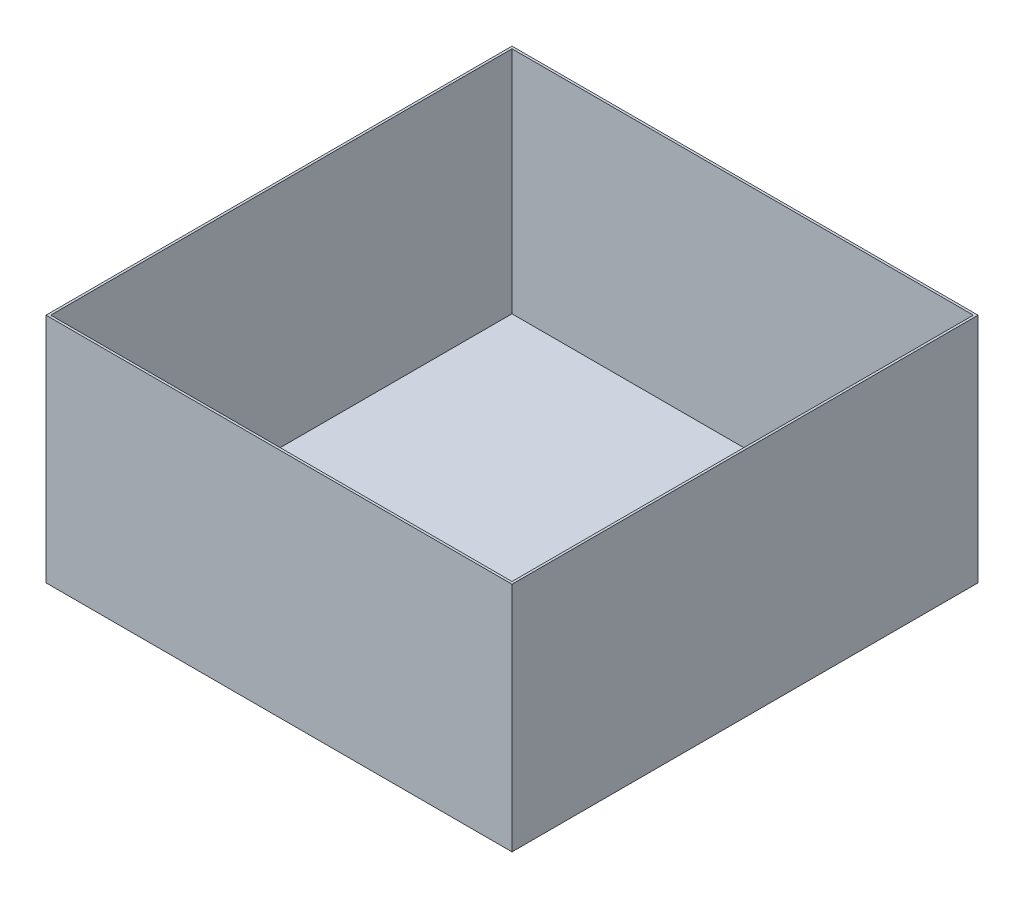
ISO-10303-21;
HEADER;
FILE_DESCRIPTION(('STEP AP214'),'2;1');
FILE_NAME('part.step','',(''),(''),'','','');
FILE_SCHEMA(('AUTOMOTIVE_DESIGN { 1 0 10303 214 1 1 1 1 }'));
ENDSEC;
DATA;
#1=APPLICATION_CONTEXT('core data for automotive mechanical design processes');
#2=APPLICATION_PROTOCOL_DEFINITION('international standard','automotive_design',2000,#1);
#3=PRODUCT_CONTEXT('',#1,'mechanical');
#4=PRODUCT('Part','Part','',(#3));
#5=PRODUCT_RELATED_PRODUCT_CATEGORY('part','',(#4));
#6=PRODUCT_DEFINITION_FORMATION('','',#4);
#7=PRODUCT_DEFINITION_CONTEXT('part definition',#1,'design');
#8=PRODUCT_DEFINITION('design','',#6,#7);
#9=PRODUCT_DEFINITION_SHAPE('','',#8);
#10=(LENGTH_UNIT() NAMED_UNIT(*) SI_UNIT(.MILLI.,.METRE.));
#11=(NAMED_UNIT(*) PLANE_ANGLE_UNIT() SI_UNIT($,.RADIAN.));
#12=(NAMED_UNIT(*) SI_UNIT($,.STERADIAN.) SOLID_ANGLE_UNIT());
#13=UNCERTAINTY_MEASURE_WITH_UNIT(LENGTH_MEASURE(1.E-05),#10,'distance_accuracy_value','');
#14=(GEOMETRIC_REPRESENTATION_CONTEXT(3) GLOBAL_UNCERTAINTY_ASSIGNED_CONTEXT((#13)) GLOBAL_UNIT_ASSIGNED_CONTEXT((#10,
#11,#12)) REPRESENTATION_CONTEXT('',''));
#15=CARTESIAN_POINT('',(0.,0.,0.));
#16=DIRECTION('',(0.,0.,1.));
#17=DIRECTION('',(1.,0.,0.));
#18=AXIS2_PLACEMENT_3D('',#15,#16,#17);
#19=CARTESIAN_POINT('',(-41.3831091569143,100.,-24.1132844986964));
#20=DIRECTION('',(1.,0.,0.));
#21=DIRECTION('',(0.,0.,-1.));
#22=AXIS2_PLACEMENT_3D('',#19,#20,#21);
#23=PLANE('',#22);
#24=DIRECTION('',(0.,0.,1.));
#25=VECTOR('',#24,1.);
#26=CARTESIAN_POINT('',(-41.3831091569143,0.,-24.1132844986964));
#27=LINE('',#26,#25);
#28=CARTESIAN_POINT('',(-41.3831091569143,0.,-24.1132844986964));
#29=VERTEX_POINT('',#28);
#30=CARTESIAN_POINT('',(-41.3831091569143,0.,176.886715501304));
#31=VERTEX_POINT('',#30);
#32=EDGE_CURVE('E147',#29,#31,#27,.T.);
#33=ORIENTED_EDGE('',*,*,#32,.T.);
#34=DIRECTION('',(0.,-1.,0.));
#35=VECTOR('',#34,1.);
#36=CARTESIAN_POINT('',(-41.3831091569143,100.,176.886715501304));
#37=LINE('',#36,#35);
#38=CARTESIAN_POINT('',(-41.3831091569143,100.,176.886715501304));
#39=VERTEX_POINT('',#38);
#40=EDGE_CURVE('E11',#39,#31,#37,.T.);
#41=ORIENTED_EDGE('',*,*,#40,.F.);
#42=DIRECTION('',(0.,0.,1.));
#43=VECTOR('',#42,1.);
#44=CARTESIAN_POINT('',(-41.3831091569143,100.,-24.1132844986964));
#45=LINE('',#44,#43);
#46=CARTESIAN_POINT('',(-41.3831091569143,100.,-24.1132844986964));
#47=VERTEX_POINT('',#46);
#48=EDGE_CURVE('E140',#47,#39,#45,.T.);
#49=ORIENTED_EDGE('',*,*,#48,.F.);
#50=DIRECTION('',(0.,-1.,0.));
#51=VECTOR('',#50,1.);
#52=CARTESIAN_POINT('',(-41.3831091569143,100.,-24.1132844986964));
#53=LINE('',#52,#51);
#54=EDGE_CURVE('E146',#47,#29,#53,.T.);
#55=ORIENTED_EDGE('',*,*,#54,.T.);
#56=EDGE_LOOP('',(#33,#41,#49,#55));
#57=FACE_BOUND('',#56,.T.);
#58=ADVANCED_FACE('F33',(#57),#23,.F.);
#59=CARTESIAN_POINT('',(-41.3831091569143,100.,176.886715501304));
#60=DIRECTION('',(0.,0.,-1.));
#61=DIRECTION('',(-1.,0.,0.));
#62=AXIS2_PLACEMENT_3D('',#59,#60,#61);
#63=PLANE('',#62);
#64=DIRECTION('',(1.,0.,0.));
#65=VECTOR('',#64,1.);
#66=CARTESIAN_POINT('',(-41.3831091569143,0.,176.886715501304));
#67=LINE('',#66,#65);
#68=CARTESIAN_POINT('',(159.616890843086,0.,176.886715501304));
#69=VERTEX_POINT('',#68);
#70=EDGE_CURVE('E150',#31,#69,#67,.T.);
#71=ORIENTED_EDGE('',*,*,#70,.T.);
#72=DIRECTION('',(0.,-1.,0.));
#73=VECTOR('',#72,1.);
#74=CARTESIAN_POINT('',(159.616890843086,100.,176.886715501304));
#75=LINE('',#74,#73);
#76=CARTESIAN_POINT('',(159.616890843086,100.,176.886715501304));
#77=VERTEX_POINT('',#76);
#78=EDGE_CURVE('E40',#77,#69,#75,.T.);
#79=ORIENTED_EDGE('',*,*,#78,.F.);
#80=DIRECTION('',(1.,0.,0.));
#81=VECTOR('',#80,1.);
#82=CARTESIAN_POINT('',(-41.3831091569143,100.,176.886715501304));
#83=LINE('',#82,#81);
#84=EDGE_CURVE('E84',#39,#77,#83,.T.);
#85=ORIENTED_EDGE('',*,*,#84,.F.);
#86=ORIENTED_EDGE('',*,*,#40,.T.);
#87=EDGE_LOOP('',(#71,#79,#85,#86));
#88=FACE_BOUND('',#87,.T.);
#89=ADVANCED_FACE('F179',(#88),#63,.F.);
#90=CARTESIAN_POINT('',(159.616890843086,100.,-24.1132844986964));
#91=DIRECTION('',(-1.,0.,0.));
#92=DIRECTION('',(0.,0.,1.));
#93=AXIS2_PLACEMENT_3D('',#90,#91,#92);
#94=PLANE('',#93);
#95=DIRECTION('',(0.,0.,-1.));
#96=VECTOR('',#95,1.);
#97=CARTESIAN_POINT('',(159.616890843086,0.,-24.1132844986964));
#98=LINE('',#97,#96);
#99=CARTESIAN_POINT('',(159.616890843086,0.,-24.1132844986964));
#100=VERTEX_POINT('',#99);
#101=EDGE_CURVE('E152',#69,#100,#98,.T.);
#102=ORIENTED_EDGE('',*,*,#101,.T.);
#103=DIRECTION('',(0.,-1.,0.));
#104=VECTOR('',#103,1.);
#105=CARTESIAN_POINT('',(159.616890843086,100.,-24.1132844986964));
#106=LINE('',#105,#104);
#107=CARTESIAN_POINT('',(159.616890843086,100.,-24.1132844986964));
#108=VERTEX_POINT('',#107);
#109=EDGE_CURVE('E156',#108,#100,#106,.T.);
#110=ORIENTED_EDGE('',*,*,#109,.F.);
#111=DIRECTION('',(0.,0.,-1.));
#112=VECTOR('',#111,1.);
#113=CARTESIAN_POINT('',(159.616890843086,100.,-24.1132844986964));
#114=LINE('',#113,#112);
#115=EDGE_CURVE('E143',#77,#108,#114,.T.);
#116=ORIENTED_EDGE('',*,*,#115,.F.);
#117=ORIENTED_EDGE('',*,*,#78,.T.);
#118=EDGE_LOOP('',(#102,#110,#116,#117));
#119=FACE_BOUND('',#118,.T.);
#120=ADVANCED_FACE('F161',(#119),#94,.F.);
#121=CARTESIAN_POINT('',(-41.3831091569143,100.,-24.1132844986964));
#122=DIRECTION('',(0.,0.,1.));
#123=DIRECTION('',(1.,0.,0.));
#124=AXIS2_PLACEMENT_3D('',#121,#122,#123);
#125=PLANE('',#124);
#126=DIRECTION('',(-1.,0.,0.));
#127=VECTOR('',#126,1.);
#128=CARTESIAN_POINT('',(-41.3831091569143,0.,-24.1132844986964));
#129=LINE('',#128,#127);
#130=EDGE_CURVE('E77',#100,#29,#129,.T.);
#131=ORIENTED_EDGE('',*,*,#130,.T.);
#132=ORIENTED_EDGE('',*,*,#54,.F.);
#133=DIRECTION('',(-1.,0.,0.));
#134=VECTOR('',#133,1.);
#135=CARTESIAN_POINT('',(-41.3831091569143,100.,-24.1132844986964));
#136=LINE('',#135,#134);
#137=EDGE_CURVE('E56',#108,#47,#136,.T.);
#138=ORIENTED_EDGE('',*,*,#137,.F.);
#139=ORIENTED_EDGE('',*,*,#109,.T.);
#140=EDGE_LOOP('',(#131,#132,#138,#139));
#141=FACE_BOUND('',#140,.T.);
#142=ADVANCED_FACE('F169',(#141),#125,.F.);
#143=CARTESIAN_POINT('',(0.,100.,0.));
#144=DIRECTION('',(0.,1.,0.));
#145=DIRECTION('',(0.,0.,1.));
#146=AXIS2_PLACEMENT_3D('',#143,#144,#145);
#147=PLANE('',#146);
#148=DIRECTION('',(0.,0.,1.));
#149=VECTOR('',#148,1.);
#150=CARTESIAN_POINT('',(-40.3831091569143,100.,-24.1132844986964));
#151=LINE('',#150,#149);
#152=CARTESIAN_POINT('',(-40.3831091569143,100.,-23.1132844986964));
#153=VERTEX_POINT('',#152);
#154=CARTESIAN_POINT('',(-40.3831091569143,100.,175.886715501304));
#155=VERTEX_POINT('',#154);
#156=EDGE_CURVE('E129',#153,#155,#151,.T.);
#157=ORIENTED_EDGE('',*,*,#156,.F.);
#158=DIRECTION('',(-1.,0.,0.));
#159=VECTOR('',#158,1.);
#160=CARTESIAN_POINT('',(-41.3831091569143,100.,-23.1132844986964));
#161=LINE('',#160,#159);
#162=CARTESIAN_POINT('',(158.616890843086,100.,-23.1132844986964));
#163=VERTEX_POINT('',#162);
#164=EDGE_CURVE('E138',#163,#153,#161,.T.);
#165=ORIENTED_EDGE('',*,*,#164,.F.);
#166=DIRECTION('',(0.,0.,-1.));
#167=VECTOR('',#166,1.);
#168=CARTESIAN_POINT('',(158.616890843086,100.,-24.1132844986964));
#169=LINE('',#168,#167);
#170=CARTESIAN_POINT('',(158.616890843086,100.,175.886715501304));
#171=VERTEX_POINT('',#170);
#172=EDGE_CURVE('E136',#171,#163,#169,.T.);
#173=ORIENTED_EDGE('',*,*,#172,.F.);
#174=DIRECTION('',(1.,0.,0.));
#175=VECTOR('',#174,1.);
#176=CARTESIAN_POINT('',(-41.3831091569143,100.,175.886715501304));
#177=LINE('',#176,#175);
#178=EDGE_CURVE('E121',#155,#171,#177,.T.);
#179=ORIENTED_EDGE('',*,*,#178,.F.);
#180=EDGE_LOOP('',(#157,#165,#173,#179));
#181=FACE_BOUND('',#180,.T.);
#182=ORIENTED_EDGE('',*,*,#48,.T.);
#183=ORIENTED_EDGE('',*,*,#84,.T.);
#184=ORIENTED_EDGE('',*,*,#115,.T.);
#185=ORIENTED_EDGE('',*,*,#137,.T.);
#186=EDGE_LOOP('',(#182,#183,#184,#185));
#187=FACE_BOUND('',#186,.T.);
#188=ADVANCED_FACE('F171',(#181,#187),#147,.T.);
#189=CARTESIAN_POINT('',(0.,0.,0.));
#190=DIRECTION('',(0.,1.,0.));
#191=DIRECTION('',(0.,0.,1.));
#192=AXIS2_PLACEMENT_3D('',#189,#190,#191);
#193=PLANE('',#192);
#194=ORIENTED_EDGE('',*,*,#32,.F.);
#195=ORIENTED_EDGE('',*,*,#130,.F.);
#196=ORIENTED_EDGE('',*,*,#101,.F.);
#197=ORIENTED_EDGE('',*,*,#70,.F.);
#198=EDGE_LOOP('',(#194,#195,#196,#197));
#199=FACE_BOUND('',#198,.T.);
#200=ADVANCED_FACE('F165',(#199),#193,.F.);
#201=CARTESIAN_POINT('',(-40.3831091569143,100.,-24.1132844986964));
#202=DIRECTION('',(1.,0.,0.));
#203=DIRECTION('',(0.,0.,-1.));
#204=AXIS2_PLACEMENT_3D('',#201,#202,#203);
#205=PLANE('',#204);
#206=DIRECTION('',(0.,0.,1.));
#207=VECTOR('',#206,1.);
#208=CARTESIAN_POINT('',(-40.3831091569143,1.,-24.1132844986964));
#209=LINE('',#208,#207);
#210=CARTESIAN_POINT('',(-40.3831091569143,1.,-23.1132844986964));
#211=VERTEX_POINT('',#210);
#212=CARTESIAN_POINT('',(-40.3831091569143,1.,175.886715501304));
#213=VERTEX_POINT('',#212);
#214=EDGE_CURVE('E112',#211,#213,#209,.T.);
#215=ORIENTED_EDGE('',*,*,#214,.F.);
#216=DIRECTION('',(0.,-1.,0.));
#217=VECTOR('',#216,1.);
#218=CARTESIAN_POINT('',(-40.3831091569143,100.,-23.1132844986964));
#219=LINE('',#218,#217);
#220=EDGE_CURVE('E132',#153,#211,#219,.T.);
#221=ORIENTED_EDGE('',*,*,#220,.F.);
#222=ORIENTED_EDGE('',*,*,#156,.T.);
#223=DIRECTION('',(0.,-1.,0.));
#224=VECTOR('',#223,1.);
#225=CARTESIAN_POINT('',(-40.3831091569143,100.,175.886715501304));
#226=LINE('',#225,#224);
#227=EDGE_CURVE('E124',#155,#213,#226,.T.);
#228=ORIENTED_EDGE('',*,*,#227,.T.);
#229=EDGE_LOOP('',(#215,#221,#222,#228));
#230=FACE_BOUND('',#229,.T.);
#231=ADVANCED_FACE('F206',(#230),#205,.T.);
#232=CARTESIAN_POINT('',(-41.3831091569143,100.,175.886715501304));
#233=DIRECTION('',(0.,0.,-1.));
#234=DIRECTION('',(-1.,0.,0.));
#235=AXIS2_PLACEMENT_3D('',#232,#233,#234);
#236=PLANE('',#235);
#237=DIRECTION('',(1.,0.,0.));
#238=VECTOR('',#237,1.);
#239=CARTESIAN_POINT('',(-41.3831091569143,1.,175.886715501304));
#240=LINE('',#239,#238);
#241=CARTESIAN_POINT('',(158.616890843086,1.,175.886715501304));
#242=VERTEX_POINT('',#241);
#243=EDGE_CURVE('E106',#213,#242,#240,.T.);
#244=ORIENTED_EDGE('',*,*,#243,.F.);
#245=ORIENTED_EDGE('',*,*,#227,.F.);
#246=ORIENTED_EDGE('',*,*,#178,.T.);
#247=DIRECTION('',(0.,-1.,0.));
#248=VECTOR('',#247,1.);
#249=CARTESIAN_POINT('',(158.616890843086,100.,175.886715501304));
#250=LINE('',#249,#248);
#251=EDGE_CURVE('E118',#171,#242,#250,.T.);
#252=ORIENTED_EDGE('',*,*,#251,.T.);
#253=EDGE_LOOP('',(#244,#245,#246,#252));
#254=FACE_BOUND('',#253,.T.);
#255=ADVANCED_FACE('F119',(#254),#236,.T.);
#256=CARTESIAN_POINT('',(158.616890843086,100.,-24.1132844986964));
#257=DIRECTION('',(-1.,0.,0.));
#258=DIRECTION('',(0.,0.,1.));
#259=AXIS2_PLACEMENT_3D('',#256,#257,#258);
#260=PLANE('',#259);
#261=DIRECTION('',(0.,0.,-1.));
#262=VECTOR('',#261,1.);
#263=CARTESIAN_POINT('',(158.616890843086,1.,-24.1132844986964));
#264=LINE('',#263,#262);
#265=CARTESIAN_POINT('',(158.616890843086,1.,-23.1132844986964));
#266=VERTEX_POINT('',#265);
#267=EDGE_CURVE('E110',#242,#266,#264,.T.);
#268=ORIENTED_EDGE('',*,*,#267,.F.);
#269=ORIENTED_EDGE('',*,*,#251,.F.);
#270=ORIENTED_EDGE('',*,*,#172,.T.);
#271=DIRECTION('',(0.,-1.,0.));
#272=VECTOR('',#271,1.);
#273=CARTESIAN_POINT('',(158.616890843086,100.,-23.1132844986964));
#274=LINE('',#273,#272);
#275=EDGE_CURVE('E47',#163,#266,#274,.T.);
#276=ORIENTED_EDGE('',*,*,#275,.T.);
#277=EDGE_LOOP('',(#268,#269,#270,#276));
#278=FACE_BOUND('',#277,.T.);
#279=ADVANCED_FACE('F126',(#278),#260,.T.);
#280=CARTESIAN_POINT('',(-41.3831091569143,100.,-23.1132844986964));
#281=DIRECTION('',(0.,0.,1.));
#282=DIRECTION('',(1.,0.,0.));
#283=AXIS2_PLACEMENT_3D('',#280,#281,#282);
#284=PLANE('',#283);
#285=DIRECTION('',(-1.,0.,0.));
#286=VECTOR('',#285,1.);
#287=CARTESIAN_POINT('',(-41.3831091569143,1.,-23.1132844986964));
#288=LINE('',#287,#286);
#289=EDGE_CURVE('E127',#266,#211,#288,.T.);
#290=ORIENTED_EDGE('',*,*,#289,.F.);
#291=ORIENTED_EDGE('',*,*,#275,.F.);
#292=ORIENTED_EDGE('',*,*,#164,.T.);
#293=ORIENTED_EDGE('',*,*,#220,.T.);
#294=EDGE_LOOP('',(#290,#291,#292,#293));
#295=FACE_BOUND('',#294,.T.);
#296=ADVANCED_FACE('F236',(#295),#284,.T.);
#297=CARTESIAN_POINT('',(0.,1.,0.));
#298=DIRECTION('',(0.,1.,0.));
#299=DIRECTION('',(0.,0.,1.));
#300=AXIS2_PLACEMENT_3D('',#297,#298,#299);
#301=PLANE('',#300);
#302=ORIENTED_EDGE('',*,*,#214,.T.);
#303=ORIENTED_EDGE('',*,*,#243,.T.);
#304=ORIENTED_EDGE('',*,*,#267,.T.);
#305=ORIENTED_EDGE('',*,*,#289,.T.);
#306=EDGE_LOOP('',(#302,#303,#304,#305));
#307=FACE_BOUND('',#306,.T.);
#308=ADVANCED_FACE('F108',(#307),#301,.T.);
#309=CLOSED_SHELL('',(#58,#89,#120,#142,#188,#200,#231,#255,#279,#296,#308));
#310=MANIFOLD_SOLID_BREP('B2',#309);
#311=ADVANCED_BREP_SHAPE_REPRESENTATION('',(#18,#310),#14);
#312=SHAPE_DEFINITION_REPRESENTATION(#9,#311);
ENDSEC;
END-ISO-10303-21;
